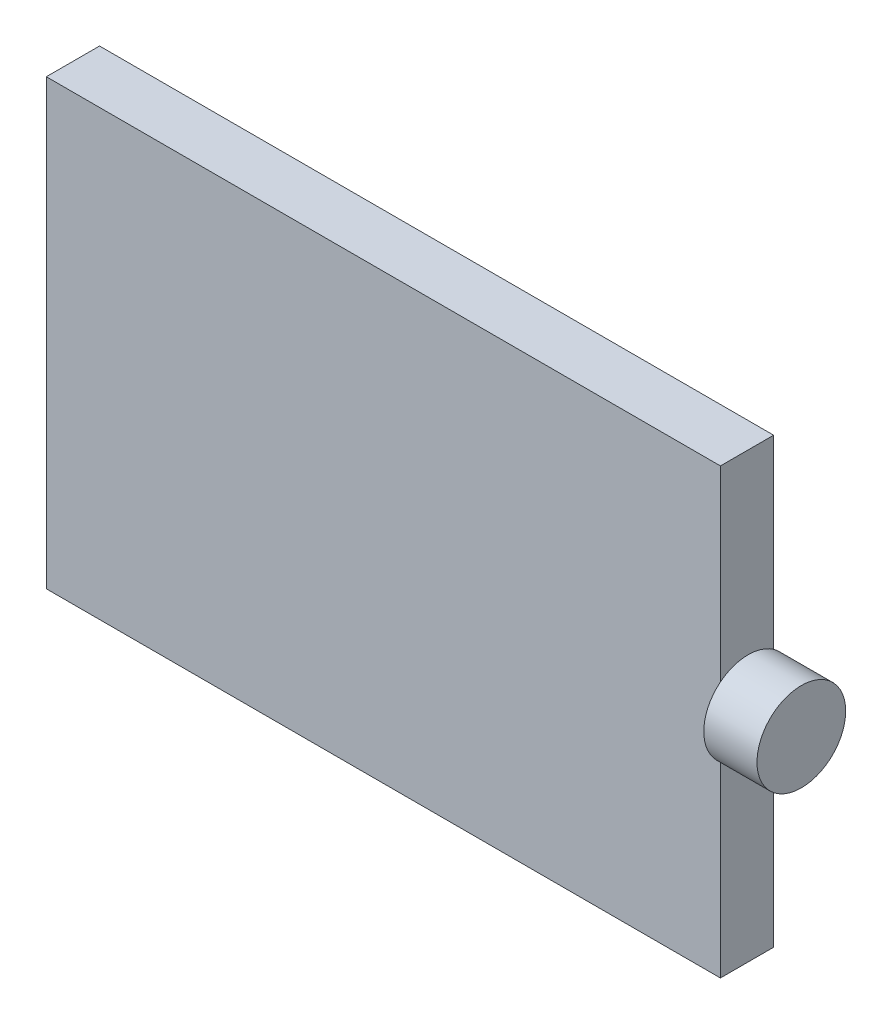
ISO-10303-21;
HEADER;
FILE_DESCRIPTION(('STEP AP214'),'2;1');
FILE_NAME('part.step','',(''),(''),'','','');
FILE_SCHEMA(('AUTOMOTIVE_DESIGN { 1 0 10303 214 1 1 1 1 }'));
ENDSEC;
DATA;
#1=APPLICATION_CONTEXT('core data for automotive mechanical design processes');
#2=APPLICATION_PROTOCOL_DEFINITION('international standard','automotive_design',2000,#1);
#3=PRODUCT_CONTEXT('',#1,'mechanical');
#4=PRODUCT('Part','Part','',(#3));
#5=PRODUCT_RELATED_PRODUCT_CATEGORY('part','',(#4));
#6=PRODUCT_DEFINITION_FORMATION('','',#4);
#7=PRODUCT_DEFINITION_CONTEXT('part definition',#1,'design');
#8=PRODUCT_DEFINITION('design','',#6,#7);
#9=PRODUCT_DEFINITION_SHAPE('','',#8);
#10=(LENGTH_UNIT() NAMED_UNIT(*) SI_UNIT(.MILLI.,.METRE.));
#11=(NAMED_UNIT(*) PLANE_ANGLE_UNIT() SI_UNIT($,.RADIAN.));
#12=(NAMED_UNIT(*) SI_UNIT($,.STERADIAN.) SOLID_ANGLE_UNIT());
#13=UNCERTAINTY_MEASURE_WITH_UNIT(LENGTH_MEASURE(1.E-05),#10,'distance_accuracy_value','');
#14=(GEOMETRIC_REPRESENTATION_CONTEXT(3) GLOBAL_UNCERTAINTY_ASSIGNED_CONTEXT((#13)) GLOBAL_UNIT_ASSIGNED_CONTEXT((#10,
#11,#12)) REPRESENTATION_CONTEXT('',''));
#15=CARTESIAN_POINT('',(0.,0.,0.));
#16=DIRECTION('',(0.,0.,1.));
#17=DIRECTION('',(1.,0.,0.));
#18=AXIS2_PLACEMENT_3D('',#15,#16,#17);
#19=CARTESIAN_POINT('',(19.,-12.5,3.));
#20=DIRECTION('',(-1.,0.,0.));
#21=DIRECTION('',(0.,0.,1.));
#22=AXIS2_PLACEMENT_3D('',#19,#20,#21);
#23=PLANE('',#22);
#24=CARTESIAN_POINT('',(19.,0.,1.43793179963729));
#25=DIRECTION('',(1.,0.,0.));
#26=DIRECTION('',(0.,0.,-1.));
#27=AXIS2_PLACEMENT_3D('',#24,#25,#26);
#28=CIRCLE('',#27,2.5);
#29=CARTESIAN_POINT('',(19.,2.04507998366613,0.));
#30=VERTEX_POINT('',#29);
#31=CARTESIAN_POINT('',(19.,1.9519075125158,3.));
#32=VERTEX_POINT('',#31);
#33=EDGE_CURVE('E42',#30,#32,#28,.T.);
#34=ORIENTED_EDGE('',*,*,#33,.F.);
#35=DIRECTION('',(0.,1.,0.));
#36=VECTOR('',#35,1.);
#37=CARTESIAN_POINT('',(19.,-12.5,0.));
#38=LINE('',#37,#36);
#39=CARTESIAN_POINT('',(19.,12.5,0.));
#40=VERTEX_POINT('',#39);
#41=EDGE_CURVE('E95',#30,#40,#38,.T.);
#42=ORIENTED_EDGE('',*,*,#41,.T.);
#43=DIRECTION('',(0.,0.,-1.));
#44=VECTOR('',#43,1.);
#45=CARTESIAN_POINT('',(19.,12.5,3.));
#46=LINE('',#45,#44);
#47=CARTESIAN_POINT('',(19.,12.5,3.));
#48=VERTEX_POINT('',#47);
#49=EDGE_CURVE('E36',#48,#40,#46,.T.);
#50=ORIENTED_EDGE('',*,*,#49,.F.);
#51=DIRECTION('',(0.,1.,0.));
#52=VECTOR('',#51,1.);
#53=CARTESIAN_POINT('',(19.,-12.5,3.));
#54=LINE('',#53,#52);
#55=EDGE_CURVE('E50',#32,#48,#54,.T.);
#56=ORIENTED_EDGE('',*,*,#55,.F.);
#57=EDGE_LOOP('',(#34,#42,#50,#56));
#58=FACE_BOUND('',#57,.T.);
#59=ADVANCED_FACE('F32',(#58),#23,.F.);
#60=CARTESIAN_POINT('',(19.,-1.9519075125158,3.));
#61=VERTEX_POINT('',#60);
#62=CARTESIAN_POINT('',(19.,-2.04507998366613,0.));
#63=VERTEX_POINT('',#62);
#64=EDGE_CURVE('E11',#61,#63,#28,.T.);
#65=ORIENTED_EDGE('',*,*,#64,.F.);
#66=CARTESIAN_POINT('',(19.,-12.5,3.));
#67=VERTEX_POINT('',#66);
#68=EDGE_CURVE('E115',#67,#61,#54,.T.);
#69=ORIENTED_EDGE('',*,*,#68,.F.);
#70=DIRECTION('',(0.,0.,-1.));
#71=VECTOR('',#70,1.);
#72=CARTESIAN_POINT('',(19.,-12.5,3.));
#73=LINE('',#72,#71);
#74=CARTESIAN_POINT('',(19.,-12.5,0.));
#75=VERTEX_POINT('',#74);
#76=EDGE_CURVE('E89',#67,#75,#73,.T.);
#77=ORIENTED_EDGE('',*,*,#76,.T.);
#78=EDGE_CURVE('E86',#75,#63,#38,.T.);
#79=ORIENTED_EDGE('',*,*,#78,.T.);
#80=EDGE_LOOP('',(#65,#69,#77,#79));
#81=FACE_BOUND('',#80,.T.);
#82=ADVANCED_FACE('F34',(#81),#23,.F.);
#83=CARTESIAN_POINT('',(-19.,12.5,3.));
#84=DIRECTION('',(0.,-1.,0.));
#85=DIRECTION('',(0.,0.,-1.));
#86=AXIS2_PLACEMENT_3D('',#83,#84,#85);
#87=PLANE('',#86);
#88=DIRECTION('',(-1.,0.,0.));
#89=VECTOR('',#88,1.);
#90=CARTESIAN_POINT('',(-19.,12.5,0.));
#91=LINE('',#90,#89);
#92=CARTESIAN_POINT('',(-19.,12.5,0.));
#93=VERTEX_POINT('',#92);
#94=EDGE_CURVE('E92',#40,#93,#91,.T.);
#95=ORIENTED_EDGE('',*,*,#94,.T.);
#96=DIRECTION('',(0.,0.,-1.));
#97=VECTOR('',#96,1.);
#98=CARTESIAN_POINT('',(-19.,12.5,3.));
#99=LINE('',#98,#97);
#100=CARTESIAN_POINT('',(-19.,12.5,3.));
#101=VERTEX_POINT('',#100);
#102=EDGE_CURVE('E132',#101,#93,#99,.T.);
#103=ORIENTED_EDGE('',*,*,#102,.F.);
#104=DIRECTION('',(-1.,0.,0.));
#105=VECTOR('',#104,1.);
#106=CARTESIAN_POINT('',(-19.,12.5,3.));
#107=LINE('',#106,#105);
#108=EDGE_CURVE('E117',#48,#101,#107,.T.);
#109=ORIENTED_EDGE('',*,*,#108,.F.);
#110=ORIENTED_EDGE('',*,*,#49,.T.);
#111=EDGE_LOOP('',(#95,#103,#109,#110));
#112=FACE_BOUND('',#111,.T.);
#113=ADVANCED_FACE('F141',(#112),#87,.F.);
#114=CARTESIAN_POINT('',(-19.,-12.5,3.));
#115=DIRECTION('',(1.,0.,0.));
#116=DIRECTION('',(0.,0.,-1.));
#117=AXIS2_PLACEMENT_3D('',#114,#115,#116);
#118=PLANE('',#117);
#119=DIRECTION('',(0.,-1.,0.));
#120=VECTOR('',#119,1.);
#121=CARTESIAN_POINT('',(-19.,-12.5,0.));
#122=LINE('',#121,#120);
#123=CARTESIAN_POINT('',(-19.,-12.5,0.));
#124=VERTEX_POINT('',#123);
#125=EDGE_CURVE('E125',#93,#124,#122,.T.);
#126=ORIENTED_EDGE('',*,*,#125,.T.);
#127=DIRECTION('',(0.,0.,-1.));
#128=VECTOR('',#127,1.);
#129=CARTESIAN_POINT('',(-19.,-12.5,3.));
#130=LINE('',#129,#128);
#131=CARTESIAN_POINT('',(-19.,-12.5,3.));
#132=VERTEX_POINT('',#131);
#133=EDGE_CURVE('E130',#132,#124,#130,.T.);
#134=ORIENTED_EDGE('',*,*,#133,.F.);
#135=DIRECTION('',(0.,-1.,0.));
#136=VECTOR('',#135,1.);
#137=CARTESIAN_POINT('',(-19.,-12.5,3.));
#138=LINE('',#137,#136);
#139=EDGE_CURVE('E120',#101,#132,#138,.T.);
#140=ORIENTED_EDGE('',*,*,#139,.F.);
#141=ORIENTED_EDGE('',*,*,#102,.T.);
#142=EDGE_LOOP('',(#126,#134,#140,#141));
#143=FACE_BOUND('',#142,.T.);
#144=ADVANCED_FACE('F143',(#143),#118,.F.);
#145=CARTESIAN_POINT('',(-19.,-12.5,3.));
#146=DIRECTION('',(0.,1.,0.));
#147=DIRECTION('',(0.,0.,1.));
#148=AXIS2_PLACEMENT_3D('',#145,#146,#147);
#149=PLANE('',#148);
#150=DIRECTION('',(1.,0.,0.));
#151=VECTOR('',#150,1.);
#152=CARTESIAN_POINT('',(-19.,-12.5,0.));
#153=LINE('',#152,#151);
#154=EDGE_CURVE('E127',#124,#75,#153,.T.);
#155=ORIENTED_EDGE('',*,*,#154,.T.);
#156=ORIENTED_EDGE('',*,*,#76,.F.);
#157=DIRECTION('',(1.,0.,0.));
#158=VECTOR('',#157,1.);
#159=CARTESIAN_POINT('',(-19.,-12.5,3.));
#160=LINE('',#159,#158);
#161=EDGE_CURVE('E122',#132,#67,#160,.T.);
#162=ORIENTED_EDGE('',*,*,#161,.F.);
#163=ORIENTED_EDGE('',*,*,#133,.T.);
#164=EDGE_LOOP('',(#155,#156,#162,#163));
#165=FACE_BOUND('',#164,.T.);
#166=ADVANCED_FACE('F146',(#165),#149,.F.);
#167=CARTESIAN_POINT('',(0.,0.,3.));
#168=DIRECTION('',(0.,0.,-1.));
#169=DIRECTION('',(-1.,0.,0.));
#170=AXIS2_PLACEMENT_3D('',#167,#168,#169);
#171=PLANE('',#170);
#172=ORIENTED_EDGE('',*,*,#68,.T.);
#173=EDGE_CURVE('E118',#61,#32,#54,.T.);
#174=ORIENTED_EDGE('',*,*,#173,.T.);
#175=ORIENTED_EDGE('',*,*,#55,.T.);
#176=ORIENTED_EDGE('',*,*,#108,.T.);
#177=ORIENTED_EDGE('',*,*,#139,.T.);
#178=ORIENTED_EDGE('',*,*,#161,.T.);
#179=EDGE_LOOP('',(#172,#174,#175,#176,#177,#178));
#180=FACE_BOUND('',#179,.T.);
#181=ADVANCED_FACE('F148',(#180),#171,.F.);
#182=CARTESIAN_POINT('',(0.,0.,0.));
#183=DIRECTION('',(0.,0.,-1.));
#184=DIRECTION('',(-1.,0.,0.));
#185=AXIS2_PLACEMENT_3D('',#182,#183,#184);
#186=PLANE('',#185);
#187=ORIENTED_EDGE('',*,*,#78,.F.);
#188=ORIENTED_EDGE('',*,*,#154,.F.);
#189=ORIENTED_EDGE('',*,*,#125,.F.);
#190=ORIENTED_EDGE('',*,*,#94,.F.);
#191=ORIENTED_EDGE('',*,*,#41,.F.);
#192=EDGE_CURVE('E93',#63,#30,#38,.T.);
#193=ORIENTED_EDGE('',*,*,#192,.F.);
#194=EDGE_LOOP('',(#187,#188,#189,#190,#191,#193));
#195=FACE_BOUND('',#194,.T.);
#196=ADVANCED_FACE('F99',(#195),#186,.T.);
#197=CARTESIAN_POINT('',(19.,0.,1.43793179963729));
#198=DIRECTION('',(1.,0.,0.));
#199=DIRECTION('',(0.,0.,-1.));
#200=AXIS2_PLACEMENT_3D('',#197,#198,#199);
#201=PLANE('',#200);
#202=EDGE_CURVE('E103',#63,#30,#28,.T.);
#203=ORIENTED_EDGE('',*,*,#202,.F.);
#204=ORIENTED_EDGE('',*,*,#192,.T.);
#205=EDGE_LOOP('',(#203,#204));
#206=FACE_BOUND('',#205,.T.);
#207=ADVANCED_FACE('F104',(#206),#201,.F.);
#208=CARTESIAN_POINT('',(22.,0.,1.43793179963729));
#209=DIRECTION('',(-1.,0.,0.));
#210=DIRECTION('',(0.,0.,1.));
#211=AXIS2_PLACEMENT_3D('',#208,#209,#210);
#212=CYLINDRICAL_SURFACE('',#211,2.5);
#213=CARTESIAN_POINT('',(22.,0.,1.43793179963729));
#214=DIRECTION('',(1.,0.,0.));
#215=DIRECTION('',(0.,0.,-1.));
#216=AXIS2_PLACEMENT_3D('',#213,#214,#215);
#217=CIRCLE('',#216,2.5);
#218=CARTESIAN_POINT('',(22.,0.,-1.06206820036271));
#219=VERTEX_POINT('',#218);
#220=EDGE_CURVE('E112',#219,#219,#217,.T.);
#221=ORIENTED_EDGE('',*,*,#220,.F.);
#222=EDGE_LOOP('',(#221));
#223=FACE_BOUND('',#222,.T.);
#224=ORIENTED_EDGE('',*,*,#33,.T.);
#225=EDGE_CURVE('E43',#32,#61,#28,.T.);
#226=ORIENTED_EDGE('',*,*,#225,.T.);
#227=ORIENTED_EDGE('',*,*,#64,.T.);
#228=ORIENTED_EDGE('',*,*,#202,.T.);
#229=EDGE_LOOP('',(#224,#226,#227,#228));
#230=FACE_BOUND('',#229,.T.);
#231=ADVANCED_FACE('F108',(#223,#230),#212,.T.);
#232=CARTESIAN_POINT('',(22.,0.,1.43793179963729));
#233=DIRECTION('',(1.,0.,0.));
#234=DIRECTION('',(0.,0.,-1.));
#235=AXIS2_PLACEMENT_3D('',#232,#233,#234);
#236=PLANE('',#235);
#237=ORIENTED_EDGE('',*,*,#220,.T.);
#238=EDGE_LOOP('',(#237));
#239=FACE_BOUND('',#238,.T.);
#240=ADVANCED_FACE('F151',(#239),#236,.T.);
#241=ORIENTED_EDGE('',*,*,#173,.F.);
#242=ORIENTED_EDGE('',*,*,#225,.F.);
#243=EDGE_LOOP('',(#241,#242));
#244=FACE_BOUND('',#243,.T.);
#245=ADVANCED_FACE('F149',(#244),#201,.F.);
#246=CLOSED_SHELL('',(#59,#82,#113,#144,#166,#181,#196,#207,#231,#240,#245));
#247=MANIFOLD_SOLID_BREP('B2',#246);
#248=ADVANCED_BREP_SHAPE_REPRESENTATION('',(#18,#247),#14);
#249=SHAPE_DEFINITION_REPRESENTATION(#9,#248);
ENDSEC;
END-ISO-10303-21;
